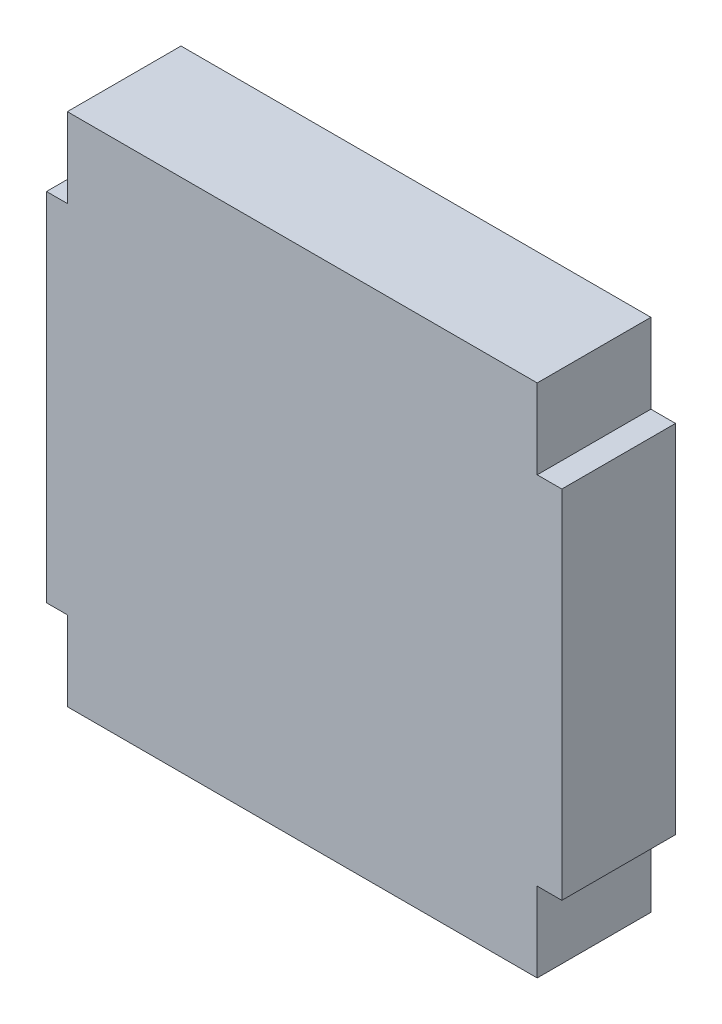
ISO-10303-21;
HEADER;
FILE_DESCRIPTION(('STEP AP214'),'2;1');
FILE_NAME('part.step','',(''),(''),'','','');
FILE_SCHEMA(('AUTOMOTIVE_DESIGN { 1 0 10303 214 1 1 1 1 }'));
ENDSEC;
DATA;
#1=APPLICATION_CONTEXT('core data for automotive mechanical design processes');
#2=APPLICATION_PROTOCOL_DEFINITION('international standard','automotive_design',2000,#1);
#3=PRODUCT_CONTEXT('',#1,'mechanical');
#4=PRODUCT('Part','Part','',(#3));
#5=PRODUCT_RELATED_PRODUCT_CATEGORY('part','',(#4));
#6=PRODUCT_DEFINITION_FORMATION('','',#4);
#7=PRODUCT_DEFINITION_CONTEXT('part definition',#1,'design');
#8=PRODUCT_DEFINITION('design','',#6,#7);
#9=PRODUCT_DEFINITION_SHAPE('','',#8);
#10=(LENGTH_UNIT() NAMED_UNIT(*) SI_UNIT(.MILLI.,.METRE.));
#11=(NAMED_UNIT(*) PLANE_ANGLE_UNIT() SI_UNIT($,.RADIAN.));
#12=(NAMED_UNIT(*) SI_UNIT($,.STERADIAN.) SOLID_ANGLE_UNIT());
#13=UNCERTAINTY_MEASURE_WITH_UNIT(LENGTH_MEASURE(1.E-05),#10,'distance_accuracy_value','');
#14=(GEOMETRIC_REPRESENTATION_CONTEXT(3) GLOBAL_UNCERTAINTY_ASSIGNED_CONTEXT((#13)) GLOBAL_UNIT_ASSIGNED_CONTEXT((#10,
#11,#12)) REPRESENTATION_CONTEXT('',''));
#15=CARTESIAN_POINT('',(0.,0.,0.));
#16=DIRECTION('',(0.,0.,1.));
#17=DIRECTION('',(1.,0.,0.));
#18=AXIS2_PLACEMENT_3D('',#15,#16,#17);
#19=CARTESIAN_POINT('',(-3.1,3.4,1.5));
#20=DIRECTION('',(0.,-1.,0.));
#21=DIRECTION('',(0.,0.,-1.));
#22=AXIS2_PLACEMENT_3D('',#19,#20,#21);
#23=PLANE('',#22);
#24=DIRECTION('',(-1.,0.,0.));
#25=VECTOR('',#24,1.);
#26=CARTESIAN_POINT('',(-3.1,3.4,0.));
#27=LINE('',#26,#25);
#28=CARTESIAN_POINT('',(3.1,3.4,0.));
#29=VERTEX_POINT('',#28);
#30=CARTESIAN_POINT('',(-3.1,3.4,0.));
#31=VERTEX_POINT('',#30);
#32=EDGE_CURVE('E154',#29,#31,#27,.T.);
#33=ORIENTED_EDGE('',*,*,#32,.T.);
#34=DIRECTION('',(0.,0.,-1.));
#35=VECTOR('',#34,1.);
#36=CARTESIAN_POINT('',(-3.1,3.4,1.5));
#37=LINE('',#36,#35);
#38=CARTESIAN_POINT('',(-3.1,3.4,1.5));
#39=VERTEX_POINT('',#38);
#40=EDGE_CURVE('E11',#39,#31,#37,.T.);
#41=ORIENTED_EDGE('',*,*,#40,.F.);
#42=DIRECTION('',(-1.,0.,0.));
#43=VECTOR('',#42,1.);
#44=CARTESIAN_POINT('',(-3.1,3.4,1.5));
#45=LINE('',#44,#43);
#46=CARTESIAN_POINT('',(3.1,3.4,1.5));
#47=VERTEX_POINT('',#46);
#48=EDGE_CURVE('E176',#47,#39,#45,.T.);
#49=ORIENTED_EDGE('',*,*,#48,.F.);
#50=DIRECTION('',(0.,0.,-1.));
#51=VECTOR('',#50,1.);
#52=CARTESIAN_POINT('',(3.1,3.4,1.5));
#53=LINE('',#52,#51);
#54=EDGE_CURVE('E150',#47,#29,#53,.T.);
#55=ORIENTED_EDGE('',*,*,#54,.T.);
#56=EDGE_LOOP('',(#33,#41,#49,#55));
#57=FACE_BOUND('',#56,.T.);
#58=ADVANCED_FACE('F34',(#57),#23,.F.);
#59=CARTESIAN_POINT('',(-3.1,2.35,1.5));
#60=DIRECTION('',(1.,0.,0.));
#61=DIRECTION('',(0.,0.,-1.));
#62=AXIS2_PLACEMENT_3D('',#59,#60,#61);
#63=PLANE('',#62);
#64=DIRECTION('',(0.,-1.,0.));
#65=VECTOR('',#64,1.);
#66=CARTESIAN_POINT('',(-3.1,2.35,0.));
#67=LINE('',#66,#65);
#68=CARTESIAN_POINT('',(-3.1,2.35,0.));
#69=VERTEX_POINT('',#68);
#70=EDGE_CURVE('E157',#31,#69,#67,.T.);
#71=ORIENTED_EDGE('',*,*,#70,.T.);
#72=DIRECTION('',(0.,0.,-1.));
#73=VECTOR('',#72,1.);
#74=CARTESIAN_POINT('',(-3.1,2.35,1.5));
#75=LINE('',#74,#73);
#76=CARTESIAN_POINT('',(-3.1,2.35,1.5));
#77=VERTEX_POINT('',#76);
#78=EDGE_CURVE('E42',#77,#69,#75,.T.);
#79=ORIENTED_EDGE('',*,*,#78,.F.);
#80=DIRECTION('',(0.,-1.,0.));
#81=VECTOR('',#80,1.);
#82=CARTESIAN_POINT('',(-3.1,2.35,1.5));
#83=LINE('',#82,#81);
#84=EDGE_CURVE('E105',#39,#77,#83,.T.);
#85=ORIENTED_EDGE('',*,*,#84,.F.);
#86=ORIENTED_EDGE('',*,*,#40,.T.);
#87=EDGE_LOOP('',(#71,#79,#85,#86));
#88=FACE_BOUND('',#87,.T.);
#89=ADVANCED_FACE('F254',(#88),#63,.F.);
#90=CARTESIAN_POINT('',(-3.375,2.35,1.5));
#91=DIRECTION('',(0.,-1.,0.));
#92=DIRECTION('',(0.,0.,-1.));
#93=AXIS2_PLACEMENT_3D('',#90,#91,#92);
#94=PLANE('',#93);
#95=DIRECTION('',(-1.,0.,0.));
#96=VECTOR('',#95,1.);
#97=CARTESIAN_POINT('',(-3.375,2.35,0.));
#98=LINE('',#97,#96);
#99=CARTESIAN_POINT('',(-3.375,2.35,0.));
#100=VERTEX_POINT('',#99);
#101=EDGE_CURVE('E159',#69,#100,#98,.T.);
#102=ORIENTED_EDGE('',*,*,#101,.T.);
#103=DIRECTION('',(0.,0.,-1.));
#104=VECTOR('',#103,1.);
#105=CARTESIAN_POINT('',(-3.375,2.35,1.5));
#106=LINE('',#105,#104);
#107=CARTESIAN_POINT('',(-3.375,2.35,1.5));
#108=VERTEX_POINT('',#107);
#109=EDGE_CURVE('E195',#108,#100,#106,.T.);
#110=ORIENTED_EDGE('',*,*,#109,.F.);
#111=DIRECTION('',(-1.,0.,0.));
#112=VECTOR('',#111,1.);
#113=CARTESIAN_POINT('',(-3.375,2.35,1.5));
#114=LINE('',#113,#112);
#115=EDGE_CURVE('E203',#77,#108,#114,.T.);
#116=ORIENTED_EDGE('',*,*,#115,.F.);
#117=ORIENTED_EDGE('',*,*,#78,.T.);
#118=EDGE_LOOP('',(#102,#110,#116,#117));
#119=FACE_BOUND('',#118,.T.);
#120=ADVANCED_FACE('F201',(#119),#94,.F.);
#121=CARTESIAN_POINT('',(-3.375,-2.35,1.5));
#122=DIRECTION('',(1.,0.,0.));
#123=DIRECTION('',(0.,0.,-1.));
#124=AXIS2_PLACEMENT_3D('',#121,#122,#123);
#125=PLANE('',#124);
#126=DIRECTION('',(0.,-1.,0.));
#127=VECTOR('',#126,1.);
#128=CARTESIAN_POINT('',(-3.375,-2.35,0.));
#129=LINE('',#128,#127);
#130=CARTESIAN_POINT('',(-3.375,-2.35,0.));
#131=VERTEX_POINT('',#130);
#132=EDGE_CURVE('E161',#100,#131,#129,.T.);
#133=ORIENTED_EDGE('',*,*,#132,.T.);
#134=DIRECTION('',(0.,0.,-1.));
#135=VECTOR('',#134,1.);
#136=CARTESIAN_POINT('',(-3.375,-2.35,1.5));
#137=LINE('',#136,#135);
#138=CARTESIAN_POINT('',(-3.375,-2.35,1.5));
#139=VERTEX_POINT('',#138);
#140=EDGE_CURVE('E192',#139,#131,#137,.T.);
#141=ORIENTED_EDGE('',*,*,#140,.F.);
#142=DIRECTION('',(0.,-1.,0.));
#143=VECTOR('',#142,1.);
#144=CARTESIAN_POINT('',(-3.375,-2.35,1.5));
#145=LINE('',#144,#143);
#146=EDGE_CURVE('E221',#108,#139,#145,.T.);
#147=ORIENTED_EDGE('',*,*,#146,.F.);
#148=ORIENTED_EDGE('',*,*,#109,.T.);
#149=EDGE_LOOP('',(#133,#141,#147,#148));
#150=FACE_BOUND('',#149,.T.);
#151=ADVANCED_FACE('F212',(#150),#125,.F.);
#152=CARTESIAN_POINT('',(-3.1,-2.35,1.5));
#153=DIRECTION('',(0.,1.,0.));
#154=DIRECTION('',(0.,0.,1.));
#155=AXIS2_PLACEMENT_3D('',#152,#153,#154);
#156=PLANE('',#155);
#157=DIRECTION('',(1.,0.,0.));
#158=VECTOR('',#157,1.);
#159=CARTESIAN_POINT('',(-3.1,-2.35,0.));
#160=LINE('',#159,#158);
#161=CARTESIAN_POINT('',(-3.1,-2.35,0.));
#162=VERTEX_POINT('',#161);
#163=EDGE_CURVE('E163',#131,#162,#160,.T.);
#164=ORIENTED_EDGE('',*,*,#163,.T.);
#165=DIRECTION('',(0.,0.,-1.));
#166=VECTOR('',#165,1.);
#167=CARTESIAN_POINT('',(-3.1,-2.35,1.5));
#168=LINE('',#167,#166);
#169=CARTESIAN_POINT('',(-3.1,-2.35,1.5));
#170=VERTEX_POINT('',#169);
#171=EDGE_CURVE('E189',#170,#162,#168,.T.);
#172=ORIENTED_EDGE('',*,*,#171,.F.);
#173=DIRECTION('',(1.,0.,0.));
#174=VECTOR('',#173,1.);
#175=CARTESIAN_POINT('',(-3.1,-2.35,1.5));
#176=LINE('',#175,#174);
#177=EDGE_CURVE('E218',#139,#170,#176,.T.);
#178=ORIENTED_EDGE('',*,*,#177,.F.);
#179=ORIENTED_EDGE('',*,*,#140,.T.);
#180=EDGE_LOOP('',(#164,#172,#178,#179));
#181=FACE_BOUND('',#180,.T.);
#182=ADVANCED_FACE('F216',(#181),#156,.F.);
#183=CARTESIAN_POINT('',(-3.1,-3.4,1.5));
#184=DIRECTION('',(1.,0.,0.));
#185=DIRECTION('',(0.,0.,-1.));
#186=AXIS2_PLACEMENT_3D('',#183,#184,#185);
#187=PLANE('',#186);
#188=DIRECTION('',(0.,-1.,0.));
#189=VECTOR('',#188,1.);
#190=CARTESIAN_POINT('',(-3.1,-3.4,0.));
#191=LINE('',#190,#189);
#192=CARTESIAN_POINT('',(-3.1,-3.4,0.));
#193=VERTEX_POINT('',#192);
#194=EDGE_CURVE('E165',#162,#193,#191,.T.);
#195=ORIENTED_EDGE('',*,*,#194,.T.);
#196=DIRECTION('',(0.,0.,-1.));
#197=VECTOR('',#196,1.);
#198=CARTESIAN_POINT('',(-3.1,-3.4,1.5));
#199=LINE('',#198,#197);
#200=CARTESIAN_POINT('',(-3.1,-3.4,1.5));
#201=VERTEX_POINT('',#200);
#202=EDGE_CURVE('E186',#201,#193,#199,.T.);
#203=ORIENTED_EDGE('',*,*,#202,.F.);
#204=DIRECTION('',(0.,-1.,0.));
#205=VECTOR('',#204,1.);
#206=CARTESIAN_POINT('',(-3.1,-3.4,1.5));
#207=LINE('',#206,#205);
#208=EDGE_CURVE('E220',#170,#201,#207,.T.);
#209=ORIENTED_EDGE('',*,*,#208,.F.);
#210=ORIENTED_EDGE('',*,*,#171,.T.);
#211=EDGE_LOOP('',(#195,#203,#209,#210));
#212=FACE_BOUND('',#211,.T.);
#213=ADVANCED_FACE('F267',(#212),#187,.F.);
#214=CARTESIAN_POINT('',(3.1,-3.4,1.5));
#215=DIRECTION('',(0.,1.,0.));
#216=DIRECTION('',(0.,0.,1.));
#217=AXIS2_PLACEMENT_3D('',#214,#215,#216);
#218=PLANE('',#217);
#219=DIRECTION('',(1.,0.,0.));
#220=VECTOR('',#219,1.);
#221=CARTESIAN_POINT('',(3.1,-3.4,0.));
#222=LINE('',#221,#220);
#223=CARTESIAN_POINT('',(3.1,-3.4,0.));
#224=VERTEX_POINT('',#223);
#225=EDGE_CURVE('E167',#193,#224,#222,.T.);
#226=ORIENTED_EDGE('',*,*,#225,.T.);
#227=DIRECTION('',(0.,0.,-1.));
#228=VECTOR('',#227,1.);
#229=CARTESIAN_POINT('',(3.1,-3.4,1.5));
#230=LINE('',#229,#228);
#231=CARTESIAN_POINT('',(3.1,-3.4,1.5));
#232=VERTEX_POINT('',#231);
#233=EDGE_CURVE('E183',#232,#224,#230,.T.);
#234=ORIENTED_EDGE('',*,*,#233,.F.);
#235=DIRECTION('',(1.,0.,0.));
#236=VECTOR('',#235,1.);
#237=CARTESIAN_POINT('',(3.1,-3.4,1.5));
#238=LINE('',#237,#236);
#239=EDGE_CURVE('E223',#201,#232,#238,.T.);
#240=ORIENTED_EDGE('',*,*,#239,.F.);
#241=ORIENTED_EDGE('',*,*,#202,.T.);
#242=EDGE_LOOP('',(#226,#234,#240,#241));
#243=FACE_BOUND('',#242,.T.);
#244=ADVANCED_FACE('F270',(#243),#218,.F.);
#245=CARTESIAN_POINT('',(3.1,-2.35,1.5));
#246=DIRECTION('',(-1.,0.,0.));
#247=DIRECTION('',(0.,0.,1.));
#248=AXIS2_PLACEMENT_3D('',#245,#246,#247);
#249=PLANE('',#248);
#250=DIRECTION('',(0.,1.,0.));
#251=VECTOR('',#250,1.);
#252=CARTESIAN_POINT('',(3.1,-2.35,0.));
#253=LINE('',#252,#251);
#254=CARTESIAN_POINT('',(3.1,-2.35,0.));
#255=VERTEX_POINT('',#254);
#256=EDGE_CURVE('E169',#224,#255,#253,.T.);
#257=ORIENTED_EDGE('',*,*,#256,.T.);
#258=DIRECTION('',(0.,0.,-1.));
#259=VECTOR('',#258,1.);
#260=CARTESIAN_POINT('',(3.1,-2.35,1.5));
#261=LINE('',#260,#259);
#262=CARTESIAN_POINT('',(3.1,-2.35,1.5));
#263=VERTEX_POINT('',#262);
#264=EDGE_CURVE('E180',#263,#255,#261,.T.);
#265=ORIENTED_EDGE('',*,*,#264,.F.);
#266=DIRECTION('',(0.,1.,0.));
#267=VECTOR('',#266,1.);
#268=CARTESIAN_POINT('',(3.1,-2.35,1.5));
#269=LINE('',#268,#267);
#270=EDGE_CURVE('E229',#232,#263,#269,.T.);
#271=ORIENTED_EDGE('',*,*,#270,.F.);
#272=ORIENTED_EDGE('',*,*,#233,.T.);
#273=EDGE_LOOP('',(#257,#265,#271,#272));
#274=FACE_BOUND('',#273,.T.);
#275=ADVANCED_FACE('F235',(#274),#249,.F.);
#276=CARTESIAN_POINT('',(3.425,-2.35,1.5));
#277=DIRECTION('',(0.,1.,0.));
#278=DIRECTION('',(0.,0.,1.));
#279=AXIS2_PLACEMENT_3D('',#276,#277,#278);
#280=PLANE('',#279);
#281=DIRECTION('',(1.,0.,0.));
#282=VECTOR('',#281,1.);
#283=CARTESIAN_POINT('',(3.425,-2.35,0.));
#284=LINE('',#283,#282);
#285=CARTESIAN_POINT('',(3.425,-2.35,0.));
#286=VERTEX_POINT('',#285);
#287=EDGE_CURVE('E171',#255,#286,#284,.T.);
#288=ORIENTED_EDGE('',*,*,#287,.T.);
#289=DIRECTION('',(0.,0.,-1.));
#290=VECTOR('',#289,1.);
#291=CARTESIAN_POINT('',(3.425,-2.35,1.5));
#292=LINE('',#291,#290);
#293=CARTESIAN_POINT('',(3.425,-2.35,1.5));
#294=VERTEX_POINT('',#293);
#295=EDGE_CURVE('E145',#294,#286,#292,.T.);
#296=ORIENTED_EDGE('',*,*,#295,.F.);
#297=DIRECTION('',(1.,0.,0.));
#298=VECTOR('',#297,1.);
#299=CARTESIAN_POINT('',(3.425,-2.35,1.5));
#300=LINE('',#299,#298);
#301=EDGE_CURVE('E136',#263,#294,#300,.T.);
#302=ORIENTED_EDGE('',*,*,#301,.F.);
#303=ORIENTED_EDGE('',*,*,#264,.T.);
#304=EDGE_LOOP('',(#288,#296,#302,#303));
#305=FACE_BOUND('',#304,.T.);
#306=ADVANCED_FACE('F239',(#305),#280,.F.);
#307=CARTESIAN_POINT('',(3.425,2.35,1.5));
#308=DIRECTION('',(-1.,0.,0.));
#309=DIRECTION('',(0.,0.,1.));
#310=AXIS2_PLACEMENT_3D('',#307,#308,#309);
#311=PLANE('',#310);
#312=DIRECTION('',(0.,1.,0.));
#313=VECTOR('',#312,1.);
#314=CARTESIAN_POINT('',(3.425,2.35,0.));
#315=LINE('',#314,#313);
#316=CARTESIAN_POINT('',(3.425,2.35,0.));
#317=VERTEX_POINT('',#316);
#318=EDGE_CURVE('E144',#286,#317,#315,.T.);
#319=ORIENTED_EDGE('',*,*,#318,.T.);
#320=DIRECTION('',(0.,0.,-1.));
#321=VECTOR('',#320,1.);
#322=CARTESIAN_POINT('',(3.425,2.35,1.5));
#323=LINE('',#322,#321);
#324=CARTESIAN_POINT('',(3.425,2.35,1.5));
#325=VERTEX_POINT('',#324);
#326=EDGE_CURVE('E141',#325,#317,#323,.T.);
#327=ORIENTED_EDGE('',*,*,#326,.F.);
#328=DIRECTION('',(0.,1.,0.));
#329=VECTOR('',#328,1.);
#330=CARTESIAN_POINT('',(3.425,2.35,1.5));
#331=LINE('',#330,#329);
#332=EDGE_CURVE('E130',#294,#325,#331,.T.);
#333=ORIENTED_EDGE('',*,*,#332,.F.);
#334=ORIENTED_EDGE('',*,*,#295,.T.);
#335=EDGE_LOOP('',(#319,#327,#333,#334));
#336=FACE_BOUND('',#335,.T.);
#337=ADVANCED_FACE('F142',(#336),#311,.F.);
#338=CARTESIAN_POINT('',(3.1,2.35,1.5));
#339=DIRECTION('',(0.,-1.,0.));
#340=DIRECTION('',(0.,0.,-1.));
#341=AXIS2_PLACEMENT_3D('',#338,#339,#340);
#342=PLANE('',#341);
#343=DIRECTION('',(-1.,0.,0.));
#344=VECTOR('',#343,1.);
#345=CARTESIAN_POINT('',(3.1,2.35,0.));
#346=LINE('',#345,#344);
#347=CARTESIAN_POINT('',(3.1,2.35,0.));
#348=VERTEX_POINT('',#347);
#349=EDGE_CURVE('E91',#317,#348,#346,.T.);
#350=ORIENTED_EDGE('',*,*,#349,.T.);
#351=DIRECTION('',(0.,0.,-1.));
#352=VECTOR('',#351,1.);
#353=CARTESIAN_POINT('',(3.1,2.35,1.5));
#354=LINE('',#353,#352);
#355=CARTESIAN_POINT('',(3.1,2.35,1.5));
#356=VERTEX_POINT('',#355);
#357=EDGE_CURVE('E146',#356,#348,#354,.T.);
#358=ORIENTED_EDGE('',*,*,#357,.F.);
#359=DIRECTION('',(-1.,0.,0.));
#360=VECTOR('',#359,1.);
#361=CARTESIAN_POINT('',(3.1,2.35,1.5));
#362=LINE('',#361,#360);
#363=EDGE_CURVE('E134',#325,#356,#362,.T.);
#364=ORIENTED_EDGE('',*,*,#363,.F.);
#365=ORIENTED_EDGE('',*,*,#326,.T.);
#366=EDGE_LOOP('',(#350,#358,#364,#365));
#367=FACE_BOUND('',#366,.T.);
#368=ADVANCED_FACE('F148',(#367),#342,.F.);
#369=CARTESIAN_POINT('',(3.1,3.4,1.5));
#370=DIRECTION('',(-1.,0.,0.));
#371=DIRECTION('',(0.,0.,1.));
#372=AXIS2_PLACEMENT_3D('',#369,#370,#371);
#373=PLANE('',#372);
#374=DIRECTION('',(0.,1.,0.));
#375=VECTOR('',#374,1.);
#376=CARTESIAN_POINT('',(3.1,3.4,0.));
#377=LINE('',#376,#375);
#378=EDGE_CURVE('E97',#348,#29,#377,.T.);
#379=ORIENTED_EDGE('',*,*,#378,.T.);
#380=ORIENTED_EDGE('',*,*,#54,.F.);
#381=DIRECTION('',(0.,1.,0.));
#382=VECTOR('',#381,1.);
#383=CARTESIAN_POINT('',(3.1,3.4,1.5));
#384=LINE('',#383,#382);
#385=EDGE_CURVE('E50',#356,#47,#384,.T.);
#386=ORIENTED_EDGE('',*,*,#385,.F.);
#387=ORIENTED_EDGE('',*,*,#357,.T.);
#388=EDGE_LOOP('',(#379,#380,#386,#387));
#389=FACE_BOUND('',#388,.T.);
#390=ADVANCED_FACE('F243',(#389),#373,.F.);
#391=CARTESIAN_POINT('',(0.,0.,1.5));
#392=DIRECTION('',(0.,0.,-1.));
#393=DIRECTION('',(-1.,0.,0.));
#394=AXIS2_PLACEMENT_3D('',#391,#392,#393);
#395=PLANE('',#394);
#396=ORIENTED_EDGE('',*,*,#48,.T.);
#397=ORIENTED_EDGE('',*,*,#84,.T.);
#398=ORIENTED_EDGE('',*,*,#115,.T.);
#399=ORIENTED_EDGE('',*,*,#146,.T.);
#400=ORIENTED_EDGE('',*,*,#177,.T.);
#401=ORIENTED_EDGE('',*,*,#208,.T.);
#402=ORIENTED_EDGE('',*,*,#239,.T.);
#403=ORIENTED_EDGE('',*,*,#270,.T.);
#404=ORIENTED_EDGE('',*,*,#301,.T.);
#405=ORIENTED_EDGE('',*,*,#332,.T.);
#406=ORIENTED_EDGE('',*,*,#363,.T.);
#407=ORIENTED_EDGE('',*,*,#385,.T.);
#408=EDGE_LOOP('',(#396,#397,#398,#399,#400,#401,#402,#403,#404,#405,#406,#407));
#409=FACE_BOUND('',#408,.T.);
#410=ADVANCED_FACE('F132',(#409),#395,.F.);
#411=CARTESIAN_POINT('',(0.,0.,0.));
#412=DIRECTION('',(0.,0.,-1.));
#413=DIRECTION('',(-1.,0.,0.));
#414=AXIS2_PLACEMENT_3D('',#411,#412,#413);
#415=PLANE('',#414);
#416=ORIENTED_EDGE('',*,*,#32,.F.);
#417=ORIENTED_EDGE('',*,*,#378,.F.);
#418=ORIENTED_EDGE('',*,*,#349,.F.);
#419=ORIENTED_EDGE('',*,*,#318,.F.);
#420=ORIENTED_EDGE('',*,*,#287,.F.);
#421=ORIENTED_EDGE('',*,*,#256,.F.);
#422=ORIENTED_EDGE('',*,*,#225,.F.);
#423=ORIENTED_EDGE('',*,*,#194,.F.);
#424=ORIENTED_EDGE('',*,*,#163,.F.);
#425=ORIENTED_EDGE('',*,*,#132,.F.);
#426=ORIENTED_EDGE('',*,*,#101,.F.);
#427=ORIENTED_EDGE('',*,*,#70,.F.);
#428=EDGE_LOOP('',(#416,#417,#418,#419,#420,#421,#422,#423,#424,#425,#426,#427));
#429=FACE_BOUND('',#428,.T.);
#430=ADVANCED_FACE('F207',(#429),#415,.T.);
#431=CLOSED_SHELL('',(#58,#89,#120,#151,#182,#213,#244,#275,#306,#337,#368,#390,#410,#430));
#432=MANIFOLD_SOLID_BREP('B2',#431);
#433=ADVANCED_BREP_SHAPE_REPRESENTATION('',(#18,#432),#14);
#434=SHAPE_DEFINITION_REPRESENTATION(#9,#433);
ENDSEC;
END-ISO-10303-21;
